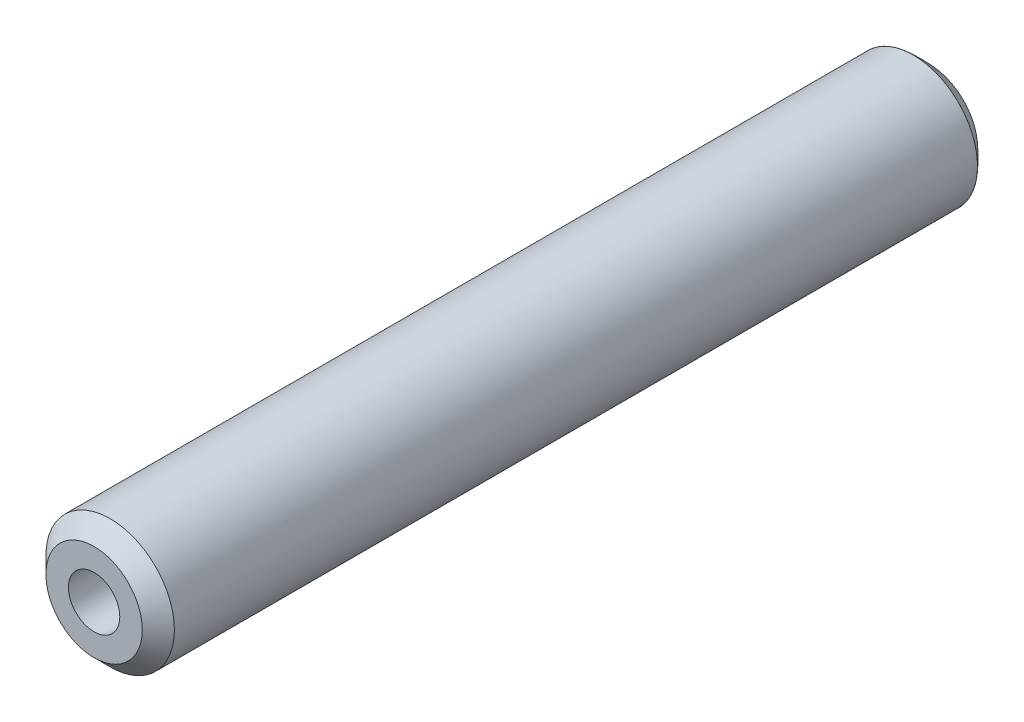
ISO-10303-21;
HEADER;
FILE_DESCRIPTION(('STEP AP214'),'2;1');
FILE_NAME('part.step','',(''),(''),'','','');
FILE_SCHEMA(('AUTOMOTIVE_DESIGN { 1 0 10303 214 1 1 1 1 }'));
ENDSEC;
DATA;
#1=APPLICATION_CONTEXT('core data for automotive mechanical design processes');
#2=APPLICATION_PROTOCOL_DEFINITION('international standard','automotive_design',2000,#1);
#3=PRODUCT_CONTEXT('',#1,'mechanical');
#4=PRODUCT('Part','Part','',(#3));
#5=PRODUCT_RELATED_PRODUCT_CATEGORY('part','',(#4));
#6=PRODUCT_DEFINITION_FORMATION('','',#4);
#7=PRODUCT_DEFINITION_CONTEXT('part definition',#1,'design');
#8=PRODUCT_DEFINITION('design','',#6,#7);
#9=PRODUCT_DEFINITION_SHAPE('','',#8);
#10=(LENGTH_UNIT() NAMED_UNIT(*) SI_UNIT(.MILLI.,.METRE.));
#11=(NAMED_UNIT(*) PLANE_ANGLE_UNIT() SI_UNIT($,.RADIAN.));
#12=(NAMED_UNIT(*) SI_UNIT($,.STERADIAN.) SOLID_ANGLE_UNIT());
#13=UNCERTAINTY_MEASURE_WITH_UNIT(LENGTH_MEASURE(1.E-05),#10,'distance_accuracy_value','');
#14=(GEOMETRIC_REPRESENTATION_CONTEXT(3) GLOBAL_UNCERTAINTY_ASSIGNED_CONTEXT((#13)) GLOBAL_UNIT_ASSIGNED_CONTEXT((#10,
#11,#12)) REPRESENTATION_CONTEXT('',''));
#15=CARTESIAN_POINT('',(0.,0.,0.));
#16=DIRECTION('',(0.,0.,1.));
#17=DIRECTION('',(1.,0.,0.));
#18=AXIS2_PLACEMENT_3D('',#15,#16,#17);
#19=CARTESIAN_POINT('',(-15.,-17.5,-8.));
#20=DIRECTION('',(0.,0.,1.));
#21=DIRECTION('',(1.,0.,0.));
#22=AXIS2_PLACEMENT_3D('',#19,#20,#21);
#23=CYLINDRICAL_SURFACE('',#22,2.);
#24=CARTESIAN_POINT('',(-13.,-17.5,2.5));
#25=CARTESIAN_POINT('',(-12.9999999470683,-17.5327241974965,2.5));
#26=CARTESIAN_POINT('',(-13.0008133145145,-17.5654477404733,2.5));
#27=CARTESIAN_POINT('',(-13.0040514588773,-17.6308145667304,2.5));
#28=CARTESIAN_POINT('',(-13.0064762098141,-17.6634578512962,2.5));
#29=CARTESIAN_POINT('',(-13.0129217490919,-17.728586858663,2.5));
#30=CARTESIAN_POINT('',(-13.0169425662685,-17.7610725786067,2.5));
#31=CARTESIAN_POINT('',(-13.0265648763823,-17.8258096124799,2.5));
#32=CARTESIAN_POINT('',(-13.0321663972611,-17.8580609222555,2.5));
#33=CARTESIAN_POINT('',(-13.0449348270466,-17.9222521602081,2.5));
#34=CARTESIAN_POINT('',(-13.0521017359533,-17.9541920883852,2.5));
#35=CARTESIAN_POINT('',(-13.0679856784994,-18.0176836192475,2.5));
#36=CARTESIAN_POINT('',(-13.0767026847343,-18.0492352287873,2.5));
#37=CARTESIAN_POINT('',(-13.0956715471788,-18.1118731398176,2.5));
#38=CARTESIAN_POINT('',(-13.1059233756553,-18.1429594497045,2.5));
#39=CARTESIAN_POINT('',(-13.1279466255026,-18.204589882949,2.5));
#40=CARTESIAN_POINT('',(-13.1397180713705,-18.2351339975571,2.5));
#41=CARTESIAN_POINT('',(-13.1647637985844,-18.2955997319033,2.5));
#42=CARTESIAN_POINT('',(-13.1780380799305,-18.3255213516415,2.5));
#43=CARTESIAN_POINT('',(-13.2060445879555,-18.3846734382671,2.5));
#44=CARTESIAN_POINT('',(-13.2207767911255,-18.4139039162898,2.5));
#45=CARTESIAN_POINT('',(-13.2516554712828,-18.4716086190359,2.5));
#46=CARTESIAN_POINT('',(-13.2678019738175,-18.5000828300863,2.5));
#47=CARTESIAN_POINT('',(-13.3014656231934,-18.5562097662276,2.5));
#48=CARTESIAN_POINT('',(-13.3189827942595,-18.5838624767875,2.5));
#49=CARTESIAN_POINT('',(-13.3553442074814,-18.6382811773542,2.5));
#50=CARTESIAN_POINT('',(-13.3741884496371,-18.6650471673609,2.5));
#51=CARTESIAN_POINT('',(-13.413160456272,-18.7176271725797,2.5));
#52=CARTESIAN_POINT('',(-13.4332881980557,-18.7434412046119,2.5));
#53=CARTESIAN_POINT('',(-13.4747836325416,-18.7940520189103,2.5));
#54=CARTESIAN_POINT('',(-13.4961513028349,-18.8188488195468,2.5));
#55=CARTESIAN_POINT('',(-13.5400830783593,-18.867359982631,2.5));
#56=CARTESIAN_POINT('',(-13.5626472028745,-18.8910743276207,2.5));
#57=CARTESIAN_POINT('',(-13.6089256723793,-18.9373527971255,2.5));
#58=CARTESIAN_POINT('',(-13.632640017369,-18.9599169216407,2.5));
#59=CARTESIAN_POINT('',(-13.6811511804532,-19.0038486971651,2.5));
#60=CARTESIAN_POINT('',(-13.7059479810897,-19.0252163674584,2.5));
#61=CARTESIAN_POINT('',(-13.7565587953881,-19.0667118019444,2.5));
#62=CARTESIAN_POINT('',(-13.7823728274204,-19.0868395437281,2.5));
#63=CARTESIAN_POINT('',(-13.8349528326392,-19.1258115503629,2.5));
#64=CARTESIAN_POINT('',(-13.8617188226459,-19.1446557925186,2.5));
#65=CARTESIAN_POINT('',(-13.9161375232125,-19.1810172057405,2.5));
#66=CARTESIAN_POINT('',(-13.9437902337723,-19.1985343768067,2.5));
#67=CARTESIAN_POINT('',(-13.999917169914,-19.2321980261825,2.5));
#68=CARTESIAN_POINT('',(-14.0283913809649,-19.2483445287172,2.5));
#69=CARTESIAN_POINT('',(-14.0860960837096,-19.2792232088746,2.5));
#70=CARTESIAN_POINT('',(-14.1153265617303,-19.2939554120449,2.5));
#71=CARTESIAN_POINT('',(-14.1744786483612,-19.3219619200691,2.5));
#72=CARTESIAN_POINT('',(-14.2044002681068,-19.3352362014142,2.5));
#73=CARTESIAN_POINT('',(-14.2648660024329,-19.3602819286309,2.5));
#74=CARTESIAN_POINT('',(-14.2954101170135,-19.3720533745026,2.5));
#75=CARTESIAN_POINT('',(-14.3570405503329,-19.3940766243394,2.5));
#76=CARTESIAN_POINT('',(-14.3881268603222,-19.4043284528016,2.5));
#77=CARTESIAN_POINT('',(-14.4507647710728,-19.4232973152853,2.5));
#78=CARTESIAN_POINT('',(-14.4823163802305,-19.4320143215736,2.5));
#79=CARTESIAN_POINT('',(-14.5458079121367,-19.4478982639735,2.5));
#80=CARTESIAN_POINT('',(-14.5777478417398,-19.4550651726805,2.5));
#81=CARTESIAN_POINT('',(-14.6419390757965,-19.4678336030117,2.5));
#82=CARTESIAN_POINT('',(-14.6741903802501,-19.473435124636,2.5));
#83=CARTESIAN_POINT('',(-14.7389274286631,-19.4830574327131,2.5));
#84=CARTESIAN_POINT('',(-14.7714131684681,-19.4870782471077,2.5));
#85=CARTESIAN_POINT('',(-14.8365421215731,-19.4935237939862,2.5));
#86=CARTESIAN_POINT('',(-14.8691853320174,-19.4959485553054,2.5));
#87=CARTESIAN_POINT('',(-14.9345523607804,-19.4991866713026,2.5));
#88=CARTESIAN_POINT('',(-14.9672761803902,-19.5,2.5));
#89=CARTESIAN_POINT('',(-15.0327238196098,-19.5,2.5));
#90=CARTESIAN_POINT('',(-15.0654476392196,-19.4991866713026,2.5));
#91=CARTESIAN_POINT('',(-15.1308146679825,-19.4959485553054,2.5));
#92=CARTESIAN_POINT('',(-15.1634578784269,-19.4935237939862,2.5));
#93=CARTESIAN_POINT('',(-15.2285868315319,-19.4870782471077,2.5));
#94=CARTESIAN_POINT('',(-15.2610725713369,-19.4830574327131,2.5));
#95=CARTESIAN_POINT('',(-15.3258096197499,-19.473435124636,2.5));
#96=CARTESIAN_POINT('',(-15.3580609242035,-19.4678336030117,2.5));
#97=CARTESIAN_POINT('',(-15.4222521582602,-19.4550651726805,2.5));
#98=CARTESIAN_POINT('',(-15.4541920878634,-19.4478982639735,2.5));
#99=CARTESIAN_POINT('',(-15.5176836197695,-19.4320143215736,2.5));
#100=CARTESIAN_POINT('',(-15.5492352289273,-19.4232973152853,2.5));
#101=CARTESIAN_POINT('',(-15.6118731396778,-19.4043284528016,2.5));
#102=CARTESIAN_POINT('',(-15.6429594496671,-19.3940766243394,2.5));
#103=CARTESIAN_POINT('',(-15.7045898829865,-19.3720533745026,2.5));
#104=CARTESIAN_POINT('',(-15.7351339975671,-19.3602819286309,2.5));
#105=CARTESIAN_POINT('',(-15.7955997318932,-19.3352362014142,2.5));
#106=CARTESIAN_POINT('',(-15.8255213516387,-19.3219619200691,2.5));
#107=CARTESIAN_POINT('',(-15.8846734382697,-19.2939554120449,2.5));
#108=CARTESIAN_POINT('',(-15.9139039162904,-19.2792232088746,2.5));
#109=CARTESIAN_POINT('',(-15.9716086190351,-19.2483445287171,2.5));
#110=CARTESIAN_POINT('',(-16.0000828300861,-19.2321980261824,2.5));
#111=CARTESIAN_POINT('',(-16.0562097662278,-19.1985343768065,2.5));
#112=CARTESIAN_POINT('',(-16.0838624767876,-19.1810172057404,2.5));
#113=CARTESIAN_POINT('',(-16.1382811773542,-19.1446557925184,2.5));
#114=CARTESIAN_POINT('',(-16.165047167361,-19.1258115503627,2.5));
#115=CARTESIAN_POINT('',(-16.2176271725798,-19.0868395437278,2.5));
#116=CARTESIAN_POINT('',(-16.2434412046121,-19.0667118019442,2.5));
#117=CARTESIAN_POINT('',(-16.2940520189105,-19.0252163674582,2.5));
#118=CARTESIAN_POINT('',(-16.3188488195469,-19.003848697165,2.5));
#119=CARTESIAN_POINT('',(-16.3673599826311,-18.9599169216406,2.5));
#120=CARTESIAN_POINT('',(-16.3910743276207,-18.9373527971255,2.5));
#121=CARTESIAN_POINT('',(-16.4373527971255,-18.8910743276207,2.5));
#122=CARTESIAN_POINT('',(-16.4599169216406,-18.8673599826311,2.5));
#123=CARTESIAN_POINT('',(-16.5038486971649,-18.818848819547,2.5));
#124=CARTESIAN_POINT('',(-16.5252163674582,-18.7940520189105,2.5));
#125=CARTESIAN_POINT('',(-16.5667118019441,-18.7434412046122,2.5));
#126=CARTESIAN_POINT('',(-16.5868395437278,-18.7176271725799,2.5));
#127=CARTESIAN_POINT('',(-16.6258115503626,-18.6650471673611,2.5));
#128=CARTESIAN_POINT('',(-16.6446557925184,-18.6382811773543,2.5));
#129=CARTESIAN_POINT('',(-16.6810172057403,-18.5838624767878,2.5));
#130=CARTESIAN_POINT('',(-16.6985343768065,-18.5562097662279,2.5));
#131=CARTESIAN_POINT('',(-16.7321980261823,-18.5000828300862,2.5));
#132=CARTESIAN_POINT('',(-16.748344528717,-18.4716086190353,2.5));
#133=CARTESIAN_POINT('',(-16.7792232088745,-18.4139039162905,2.5));
#134=CARTESIAN_POINT('',(-16.7939554120448,-18.3846734382698,2.5));
#135=CARTESIAN_POINT('',(-16.8219619200691,-18.3255213516388,2.5));
#136=CARTESIAN_POINT('',(-16.8352362014142,-18.2955997318933,2.5));
#137=CARTESIAN_POINT('',(-16.8602819286309,-18.2351339975671,2.5));
#138=CARTESIAN_POINT('',(-16.8720533745026,-18.2045898829865,2.5));
#139=CARTESIAN_POINT('',(-16.8940766243394,-18.142959449667,2.5));
#140=CARTESIAN_POINT('',(-16.9043284528016,-18.1118731396777,2.5));
#141=CARTESIAN_POINT('',(-16.9232973152853,-18.0492352289272,2.5));
#142=CARTESIAN_POINT('',(-16.9320143215737,-18.0176836197694,2.5));
#143=CARTESIAN_POINT('',(-16.9478982639735,-17.9541920878632,2.5));
#144=CARTESIAN_POINT('',(-16.9550651726805,-17.9222521582601,2.5));
#145=CARTESIAN_POINT('',(-16.9678336030117,-17.8580609242034,2.5));
#146=CARTESIAN_POINT('',(-16.973435124636,-17.8258096197499,2.5));
#147=CARTESIAN_POINT('',(-16.9830574327131,-17.7610725713369,2.5));
#148=CARTESIAN_POINT('',(-16.9870782471077,-17.7285868315319,2.5));
#149=CARTESIAN_POINT('',(-16.9935237939862,-17.6634578784269,2.5));
#150=CARTESIAN_POINT('',(-16.9959485553054,-17.6308146679825,2.5));
#151=CARTESIAN_POINT('',(-16.9991866713026,-17.5654476392196,2.5));
#152=CARTESIAN_POINT('',(-17.,-17.5327238196098,2.5));
#153=CARTESIAN_POINT('',(-17.,-17.4672761803902,2.5));
#154=CARTESIAN_POINT('',(-16.9991866713026,-17.4345523607805,2.5));
#155=CARTESIAN_POINT('',(-16.9959485553054,-17.3691853320175,2.5));
#156=CARTESIAN_POINT('',(-16.9935237939862,-17.3365421215732,2.5));
#157=CARTESIAN_POINT('',(-16.9870782471077,-17.2714131684682,2.5));
#158=CARTESIAN_POINT('',(-16.9830574327132,-17.2389274286632,2.5));
#159=CARTESIAN_POINT('',(-16.973435124636,-17.1741903802502,2.5));
#160=CARTESIAN_POINT('',(-16.9678336030118,-17.1419390757966,2.5));
#161=CARTESIAN_POINT('',(-16.9550651726805,-17.0777478417399,2.5));
#162=CARTESIAN_POINT('',(-16.9478982639736,-17.0458079121368,2.5));
#163=CARTESIAN_POINT('',(-16.9320143215737,-16.9823163802306,2.5));
#164=CARTESIAN_POINT('',(-16.9232973152853,-16.9507647710729,2.5));
#165=CARTESIAN_POINT('',(-16.9043284528016,-16.8881268603223,2.5));
#166=CARTESIAN_POINT('',(-16.8940766243394,-16.857040550333,2.5));
#167=CARTESIAN_POINT('',(-16.8720533745026,-16.7954101170136,2.5));
#168=CARTESIAN_POINT('',(-16.8602819286309,-16.7648660024329,2.5));
#169=CARTESIAN_POINT('',(-16.8352362014142,-16.7044002681067,2.5));
#170=CARTESIAN_POINT('',(-16.8219619200691,-16.6744786483612,2.5));
#171=CARTESIAN_POINT('',(-16.7939554120448,-16.6153265617302,2.5));
#172=CARTESIAN_POINT('',(-16.7792232088745,-16.5860960837095,2.5));
#173=CARTESIAN_POINT('',(-16.7483445287171,-16.5283913809648,2.5));
#174=CARTESIAN_POINT('',(-16.7321980261824,-16.4999171699139,2.5));
#175=CARTESIAN_POINT('',(-16.6985343768066,-16.4437902337722,2.5));
#176=CARTESIAN_POINT('',(-16.6810172057405,-16.4161375232124,2.5));
#177=CARTESIAN_POINT('',(-16.6446557925186,-16.3617188226458,2.5));
#178=CARTESIAN_POINT('',(-16.6258115503628,-16.3349528326391,2.5));
#179=CARTESIAN_POINT('',(-16.586839543728,-16.2823728274203,2.5));
#180=CARTESIAN_POINT('',(-16.5667118019443,-16.256558795388,2.5));
#181=CARTESIAN_POINT('',(-16.5252163674584,-16.2059479810897,2.5));
#182=CARTESIAN_POINT('',(-16.5038486971651,-16.1811511804532,2.5));
#183=CARTESIAN_POINT('',(-16.4599169216407,-16.132640017369,2.5));
#184=CARTESIAN_POINT('',(-16.4373527971255,-16.1089256723793,2.5));
#185=CARTESIAN_POINT('',(-16.3910743276207,-16.0626472028745,2.5));
#186=CARTESIAN_POINT('',(-16.367359982631,-16.0400830783593,2.5));
#187=CARTESIAN_POINT('',(-16.3188488195468,-15.9961513028349,2.5));
#188=CARTESIAN_POINT('',(-16.2940520189103,-15.9747836325416,2.5));
#189=CARTESIAN_POINT('',(-16.2434412046119,-15.9332881980557,2.5));
#190=CARTESIAN_POINT('',(-16.2176271725797,-15.913160456272,2.5));
#191=CARTESIAN_POINT('',(-16.1650471673609,-15.8741884496372,2.5));
#192=CARTESIAN_POINT('',(-16.1382811773541,-15.8553442074814,2.5));
#193=CARTESIAN_POINT('',(-16.0838624767876,-15.8189827942595,2.5));
#194=CARTESIAN_POINT('',(-16.0562097662278,-15.8014656231934,2.5));
#195=CARTESIAN_POINT('',(-16.0000828300861,-15.7678019738176,2.5));
#196=CARTESIAN_POINT('',(-15.9716086190352,-15.7516554712829,2.5));
#197=CARTESIAN_POINT('',(-15.9139039162905,-15.7207767911254,2.5));
#198=CARTESIAN_POINT('',(-15.8846734382698,-15.7060445879551,2.5));
#199=CARTESIAN_POINT('',(-15.8255213516388,-15.6780380799309,2.5));
#200=CARTESIAN_POINT('',(-15.7955997318933,-15.6647637985858,2.5));
#201=CARTESIAN_POINT('',(-15.7351339975671,-15.6397180713691,2.5));
#202=CARTESIAN_POINT('',(-15.7045898829865,-15.6279466254974,2.5));
#203=CARTESIAN_POINT('',(-15.642959449667,-15.6059233756606,2.5));
#204=CARTESIAN_POINT('',(-15.6118731396778,-15.5956715471984,2.5));
#205=CARTESIAN_POINT('',(-15.5492352289272,-15.5767026847147,2.5));
#206=CARTESIAN_POINT('',(-15.5176836197695,-15.5679856784263,2.5));
#207=CARTESIAN_POINT('',(-15.4541920878633,-15.5521017360264,2.5));
#208=CARTESIAN_POINT('',(-15.4222521582602,-15.5449348273195,2.5));
#209=CARTESIAN_POINT('',(-15.3580609242036,-15.5321663969883,2.5));
#210=CARTESIAN_POINT('',(-15.32580961975,-15.526564875364,2.5));
#211=CARTESIAN_POINT('',(-15.261072571337,-15.5169425672869,2.5));
#212=CARTESIAN_POINT('',(-15.228586831532,-15.5129217528923,2.5));
#213=CARTESIAN_POINT('',(-15.163457878427,-15.5064762060138,2.5));
#214=CARTESIAN_POINT('',(-15.1308146679826,-15.5040514446946,2.5));
#215=CARTESIAN_POINT('',(-15.0654476392196,-15.5008133286974,2.5));
#216=CARTESIAN_POINT('',(-15.0327238196098,-15.5,2.5));
#217=CARTESIAN_POINT('',(-14.9672761803902,-15.5,2.5));
#218=CARTESIAN_POINT('',(-14.9345523607804,-15.5008133286974,2.5));
#219=CARTESIAN_POINT('',(-14.8691853320173,-15.5040514446946,2.5));
#220=CARTESIAN_POINT('',(-14.836542121573,-15.5064762060138,2.5));
#221=CARTESIAN_POINT('',(-14.771413168468,-15.5129217528923,2.5));
#222=CARTESIAN_POINT('',(-14.738927428663,-15.5169425672869,2.5));
#223=CARTESIAN_POINT('',(-14.67419038025,-15.526564875364,2.5));
#224=CARTESIAN_POINT('',(-14.6419390757964,-15.5321663969883,2.5));
#225=CARTESIAN_POINT('',(-14.5777478417397,-15.5449348273195,2.5));
#226=CARTESIAN_POINT('',(-14.5458079121366,-15.5521017360265,2.5));
#227=CARTESIAN_POINT('',(-14.4823163802305,-15.5679856784264,2.5));
#228=CARTESIAN_POINT('',(-14.4507647710728,-15.5767026847147,2.5));
#229=CARTESIAN_POINT('',(-14.3881268603222,-15.5956715471984,2.5));
#230=CARTESIAN_POINT('',(-14.3570405503329,-15.6059233756606,2.5));
#231=CARTESIAN_POINT('',(-14.2954101170135,-15.6279466254974,2.5));
#232=CARTESIAN_POINT('',(-14.2648660024329,-15.6397180713691,2.5));
#233=CARTESIAN_POINT('',(-14.2044002681067,-15.6647637985858,2.5));
#234=CARTESIAN_POINT('',(-14.1744786483612,-15.6780380799309,2.5));
#235=CARTESIAN_POINT('',(-14.1153265617302,-15.7060445879552,2.5));
#236=CARTESIAN_POINT('',(-14.0860960837095,-15.7207767911255,2.5));
#237=CARTESIAN_POINT('',(-14.0283913809648,-15.7516554712829,2.5));
#238=CARTESIAN_POINT('',(-13.9999171699139,-15.7678019738176,2.5));
#239=CARTESIAN_POINT('',(-13.9437902337721,-15.8014656231935,2.5));
#240=CARTESIAN_POINT('',(-13.9161375232123,-15.8189827942596,2.5));
#241=CARTESIAN_POINT('',(-13.8617188226458,-15.8553442074815,2.5));
#242=CARTESIAN_POINT('',(-13.834952832639,-15.8741884496373,2.5));
#243=CARTESIAN_POINT('',(-13.7823728274202,-15.9131604562721,2.5));
#244=CARTESIAN_POINT('',(-13.7565587953879,-15.9332881980558,2.5));
#245=CARTESIAN_POINT('',(-13.7059479810896,-15.9747836325417,2.5));
#246=CARTESIAN_POINT('',(-13.6811511804531,-15.996151302835,2.5));
#247=CARTESIAN_POINT('',(-13.6326400173689,-16.0400830783594,2.5));
#248=CARTESIAN_POINT('',(-13.6089256723793,-16.0626472028745,2.5));
#249=CARTESIAN_POINT('',(-13.5626472028745,-16.1089256723793,2.5));
#250=CARTESIAN_POINT('',(-13.5400830783594,-16.1326400173689,2.5));
#251=CARTESIAN_POINT('',(-13.496151302835,-16.1811511804531,2.5));
#252=CARTESIAN_POINT('',(-13.4747836325417,-16.2059479810896,2.5));
#253=CARTESIAN_POINT('',(-13.4332881980558,-16.2565587953879,2.5));
#254=CARTESIAN_POINT('',(-13.4131604562721,-16.2823728274202,2.5));
#255=CARTESIAN_POINT('',(-13.3741884496373,-16.334952832639,2.5));
#256=CARTESIAN_POINT('',(-13.3553442074815,-16.3617188226457,2.5));
#257=CARTESIAN_POINT('',(-13.3189827942596,-16.4161375232124,2.5));
#258=CARTESIAN_POINT('',(-13.3014656231935,-16.4437902337723,2.5));
#259=CARTESIAN_POINT('',(-13.2678019738176,-16.4999171699137,2.5));
#260=CARTESIAN_POINT('',(-13.2516554712828,-16.5283913809641,2.5));
#261=CARTESIAN_POINT('',(-13.2207767911256,-16.5860960837102,2.5));
#262=CARTESIAN_POINT('',(-13.2060445879555,-16.6153265617329,2.5));
#263=CARTESIAN_POINT('',(-13.1780380799305,-16.6744786483585,2.5));
#264=CARTESIAN_POINT('',(-13.1647637985844,-16.7044002680967,2.5));
#265=CARTESIAN_POINT('',(-13.1397180713705,-16.764866002443,2.5));
#266=CARTESIAN_POINT('',(-13.1279466255026,-16.795410117051,2.5));
#267=CARTESIAN_POINT('',(-13.1059233756553,-16.8570405502955,2.5));
#268=CARTESIAN_POINT('',(-13.0956715471788,-16.8881268601824,2.5));
#269=CARTESIAN_POINT('',(-13.0767026847342,-16.9507647712127,2.5));
#270=CARTESIAN_POINT('',(-13.0679856784994,-16.9823163807526,2.5));
#271=CARTESIAN_POINT('',(-13.0521017359533,-17.0458079116148,2.5));
#272=CARTESIAN_POINT('',(-13.0449348270466,-17.0777478397919,2.5));
#273=CARTESIAN_POINT('',(-13.0321663972611,-17.1419390777446,2.5));
#274=CARTESIAN_POINT('',(-13.0265648763823,-17.1741903875201,2.5));
#275=CARTESIAN_POINT('',(-13.0169425662685,-17.2389274213933,2.5));
#276=CARTESIAN_POINT('',(-13.0129217490919,-17.271413141337,2.5));
#277=CARTESIAN_POINT('',(-13.0064762098141,-17.3365421487038,2.5));
#278=CARTESIAN_POINT('',(-13.0040514588773,-17.3691854332696,2.5));
#279=CARTESIAN_POINT('',(-13.0008133145145,-17.4345522595267,2.5));
#280=CARTESIAN_POINT('',(-12.9999999470683,-17.4672758025035,2.5));
#281=CARTESIAN_POINT('',(-13.,-17.5,2.5));
#282=B_SPLINE_CURVE_WITH_KNOTS('',3,(#24,#25,#26,#27,#28,#29,#30,#31,#32,#33,#34,#35,#36,#37,
#38,#39,#40,#41,#42,#43,#44,#45,#46,#47,#48,#49,#50,#51,#52,#53,#54,#55,#56,#57,#58,#59,#60,#61,
#62,#63,#64,#65,#66,#67,#68,#69,#70,#71,#72,#73,#74,#75,#76,#77,#78,#79,#80,#81,#82,#83,#84,#85,
#86,#87,#88,#89,#90,#91,#92,#93,#94,#95,#96,#97,#98,#99,#100,#101,#102,#103,#104,#105,#106,#107,
#108,#109,#110,#111,#112,#113,#114,#115,#116,#117,#118,#119,#120,#121,#122,#123,#124,#125,#126,
#127,#128,#129,#130,#131,#132,#133,#134,#135,#136,#137,#138,#139,#140,#141,#142,#143,#144,#145,
#146,#147,#148,#149,#150,#151,#152,#153,#154,#155,#156,#157,#158,#159,#160,#161,#162,#163,#164,
#165,#166,#167,#168,#169,#170,#171,#172,#173,#174,#175,#176,#177,#178,#179,#180,#181,#182,#183,
#184,#185,#186,#187,#188,#189,#190,#191,#192,#193,#194,#195,#196,#197,#198,#199,#200,#201,#202,
#203,#204,#205,#206,#207,#208,#209,#210,#211,#212,#213,#214,#215,#216,#217,#218,#219,#220,#221,
#222,#223,#224,#225,#226,#227,#228,#229,#230,#231,#232,#233,#234,#235,#236,#237,#238,#239,#240,
#241,#242,#243,#244,#245,#246,#247,#248,#249,#250,#251,#252,#253,#254,#255,#256,#257,#258,#259,
#260,#261,#262,#263,#264,#265,#266,#267,#268,#269,#270,#271,#272,#273,#274,#275,#276,#277,#278,
#279,#280,#281),.UNSPECIFIED.,.F.,.F.,(4,2,2,2,2,2,2,2,2,2,2,2,2,2,2,2,2,2,2,2,2,2,2,2,2,2,2,2,
2,2,2,2,2,2,2,2,2,2,2,2,2,2,2,2,2,2,2,2,2,2,2,2,2,2,2,2,2,2,2,2,2,2,2,2,2,2,2,2,2,2,2,2,2,2,2,2,
2,2,2,2,2,2,2,2,2,2,2,2,2,2,2,2,2,2,2,2,2,2,2,2,2,2,2,2,2,2,2,2,2,2,2,2,2,2,2,2,2,2,2,2,2,2,2,2,
2,2,2,2,4),(0.,0.0981615585893566,0.196321534588035,0.294483284087453,0.392646768874277,
0.490810253661114,0.588972003160559,0.68713197915929,0.785293537748715,0.883455096338132,
0.981615072336836,1.07977682183625,1.17794030662306,1.27610379140988,1.3742655409093,
1.472425516908,1.57058707549743,1.66874863408687,1.76690861008559,1.86507035958504,
1.96323384437187,2.06139732915869,2.1595590786581,2.25771905465677,2.35588061324614,
2.45404217183551,2.55220214783421,2.65036389733365,2.74852738212049,2.84669086690734,
2.94485261640678,3.04301259240547,3.14117415099485,3.23933570958422,3.33749568558293,
3.43565743508239,3.53382091986925,3.63198440465611,3.73014615415554,3.82830613015422,
3.92646768874356,4.02462924733292,4.12278922333164,4.22095097283114,4.31911445761804,
4.41727794240493,4.51543969190438,4.61359966790302,4.71176122649225,4.80992278508147,
4.90808276108008,5.00624451057949,5.10440799536635,5.20257148015324,5.30073322965274,
5.39889320565152,5.49705476424096,5.59521632283039,5.69337629882911,5.79153804832855,
5.88970153311538,5.9878650179022,6.08602676740162,6.1841867434003,6.28234830198967,
6.38050986057903,6.47866983657769,6.57683158607709,6.67499507086391,6.77315855565073,
6.87132030515018,6.96948028114892,7.06764183973838,7.16580339832784,7.26396337432656,
7.36212512382598,7.46028860861278,7.55845209339957,7.65661384289898,7.75477381889767,
7.8529353774871,7.95109693607652,8.04925691207524,8.14741866157465,8.24558214636147,
8.34374563114827,8.44190738064769,8.5400673566464,8.63822891523581,8.73639047382523,
8.83455044982392,8.93271219932332,9.03087568411011,9.12903916889692,9.22720091839634,
9.32536089439506,9.42352245298453,9.52168401157399,9.61984398757272,9.71800573707215,
9.81616922185895,9.91433270664575,10.0124944561452,10.1106544321438,10.2088159907332,
10.3069775493227,10.4051375253214,10.5032992748209,10.6014627596077,10.6996262443946,
10.797787993894,10.8959479698926,10.994109528482,11.0922710870713,11.1904310630699,
11.2885928125693,11.3867562973562,11.484919782143,11.5830815316425,11.6812415076412,
11.7794030662307,11.8775646248201,11.9757246008188,12.0738863503183,12.1720498351051,
12.2702133198919,12.3683750693913,12.46653504539,12.5646966039794),.UNSPECIFIED.);
#283=CARTESIAN_POINT('',(-13.,-17.5,2.5));
#284=VERTEX_POINT('',#283);
#285=EDGE_CURVE('E60',#284,#284,#282,.F.);
#286=ORIENTED_EDGE('',*,*,#285,.T.);
#287=EDGE_LOOP('',(#286));
#288=FACE_BOUND('',#287,.T.);
#289=CARTESIAN_POINT('',(-15.,-17.5,27.5));
#290=DIRECTION('',(0.,0.,1.));
#291=DIRECTION('',(1.,0.,0.));
#292=AXIS2_PLACEMENT_3D('',#289,#290,#291);
#293=CIRCLE('',#292,2.);
#294=CARTESIAN_POINT('',(-13.,-17.5,27.5));
#295=VERTEX_POINT('',#294);
#296=EDGE_CURVE('E76',#295,#295,#293,.F.);
#297=ORIENTED_EDGE('',*,*,#296,.T.);
#298=EDGE_LOOP('',(#297));
#299=FACE_BOUND('',#298,.T.);
#300=ADVANCED_FACE('F47',(#288,#299),#23,.T.);
#301=CARTESIAN_POINT('',(-15.,-17.5,28.));
#302=DIRECTION('',(0.,0.,1.));
#303=DIRECTION('',(1.,0.,0.));
#304=AXIS2_PLACEMENT_3D('',#301,#302,#303);
#305=PLANE('',#304);
#306=CARTESIAN_POINT('',(-15.,-17.5,28.));
#307=DIRECTION('',(0.,0.,1.));
#308=DIRECTION('',(1.,0.,0.));
#309=AXIS2_PLACEMENT_3D('',#306,#307,#308);
#310=CIRCLE('',#309,0.79999999999999);
#311=CARTESIAN_POINT('',(-14.2,-17.5,28.));
#312=VERTEX_POINT('',#311);
#313=EDGE_CURVE('E90',#312,#312,#310,.T.);
#314=ORIENTED_EDGE('',*,*,#313,.F.);
#315=EDGE_LOOP('',(#314));
#316=FACE_BOUND('',#315,.T.);
#317=CARTESIAN_POINT('',(-15.,-17.5,28.));
#318=DIRECTION('',(0.,0.,1.));
#319=DIRECTION('',(1.,0.,0.));
#320=AXIS2_PLACEMENT_3D('',#317,#318,#319);
#321=CIRCLE('',#320,1.5);
#322=CARTESIAN_POINT('',(-13.5,-17.5,28.));
#323=VERTEX_POINT('',#322);
#324=EDGE_CURVE('E80',#323,#323,#321,.T.);
#325=ORIENTED_EDGE('',*,*,#324,.T.);
#326=EDGE_LOOP('',(#325));
#327=FACE_BOUND('',#326,.T.);
#328=ADVANCED_FACE('F111',(#316,#327),#305,.T.);
#329=CARTESIAN_POINT('',(-15.,-17.5,28.));
#330=DIRECTION('',(0.,0.,-1.));
#331=DIRECTION('',(-1.,0.,0.));
#332=AXIS2_PLACEMENT_3D('',#329,#330,#331);
#333=CONICAL_SURFACE('',#332,1.5,0.785398163397441);
#334=ORIENTED_EDGE('',*,*,#296,.F.);
#335=EDGE_LOOP('',(#334));
#336=FACE_BOUND('',#335,.T.);
#337=ORIENTED_EDGE('',*,*,#324,.F.);
#338=EDGE_LOOP('',(#337));
#339=FACE_BOUND('',#338,.T.);
#340=ADVANCED_FACE('F112',(#336,#339),#333,.T.);
#341=CARTESIAN_POINT('',(-15.,-17.5,21.));
#342=DIRECTION('',(0.,0.,1.));
#343=DIRECTION('',(1.,0.,0.));
#344=AXIS2_PLACEMENT_3D('',#341,#342,#343);
#345=CONICAL_SURFACE('',#344,0.799999999999988,1.02974425867665);
#346=CARTESIAN_POINT('',(-15.,-17.5,20.5193115047779));
#347=VERTEX_POINT('',#346);
#348=VERTEX_LOOP('',#347);
#349=FACE_BOUND('',#348,.T.);
#350=CARTESIAN_POINT('',(-15.,-17.5,21.));
#351=DIRECTION('',(0.,0.,1.));
#352=DIRECTION('',(1.,0.,0.));
#353=AXIS2_PLACEMENT_3D('',#350,#351,#352);
#354=CIRCLE('',#353,0.799999999999988);
#355=CARTESIAN_POINT('',(-14.2,-17.5,21.));
#356=VERTEX_POINT('',#355);
#357=EDGE_CURVE('E86',#356,#356,#354,.T.);
#358=ORIENTED_EDGE('',*,*,#357,.T.);
#359=EDGE_LOOP('',(#358));
#360=FACE_BOUND('',#359,.T.);
#361=ADVANCED_FACE('F116',(#349,#360),#345,.F.);
#362=CARTESIAN_POINT('',(-15.,-17.5,28.));
#363=DIRECTION('',(0.,0.,1.));
#364=DIRECTION('',(1.,0.,0.));
#365=AXIS2_PLACEMENT_3D('',#362,#363,#364);
#366=CYLINDRICAL_SURFACE('',#365,0.799999999999989);
#367=ORIENTED_EDGE('',*,*,#357,.F.);
#368=EDGE_LOOP('',(#367));
#369=FACE_BOUND('',#368,.T.);
#370=ORIENTED_EDGE('',*,*,#313,.T.);
#371=EDGE_LOOP('',(#370));
#372=FACE_BOUND('',#371,.T.);
#373=ADVANCED_FACE('F119',(#369,#372),#366,.F.);
#374=CARTESIAN_POINT('',(0.,0.,2.));
#375=DIRECTION('',(0.,0.,1.));
#376=DIRECTION('',(1.,0.,0.));
#377=AXIS2_PLACEMENT_3D('',#374,#375,#376);
#378=PLANE('',#377);
#379=CARTESIAN_POINT('',(-13.5,-17.5,2.));
#380=CARTESIAN_POINT('',(-13.5,-17.3036504736953,2.));
#381=CARTESIAN_POINT('',(-13.5390409905634,-17.1073781600239,2.));
#382=CARTESIAN_POINT('',(-13.6893204119028,-16.7445715428809,2.));
#383=CARTESIAN_POINT('',(-13.8004997466871,-16.578179909753,2.));
#384=CARTESIAN_POINT('',(-14.0781799097533,-16.3004997466874,2.));
#385=CARTESIAN_POINT('',(-14.2445715428808,-16.1893204119029,2.));
#386=CARTESIAN_POINT('',(-14.6073781600239,-16.0390409905632,2.));
#387=CARTESIAN_POINT('',(-14.8036504736949,-16.,2.));
#388=CARTESIAN_POINT('',(-15.1963495263051,-16.,2.));
#389=CARTESIAN_POINT('',(-15.3926218399761,-16.0390409905635,2.));
#390=CARTESIAN_POINT('',(-15.7554284571192,-16.1893204119026,2.));
#391=CARTESIAN_POINT('',(-15.9218200902467,-16.300499746687,2.));
#392=CARTESIAN_POINT('',(-16.199500253313,-16.5781799097533,2.));
#393=CARTESIAN_POINT('',(-16.3106795880971,-16.7445715428808,2.));
#394=CARTESIAN_POINT('',(-16.4609590094368,-17.1073781600239,2.));
#395=CARTESIAN_POINT('',(-16.5,-17.3036504736952,2.));
#396=CARTESIAN_POINT('',(-16.5,-17.6963495263048,2.));
#397=CARTESIAN_POINT('',(-16.4609590094365,-17.8926218399761,2.));
#398=CARTESIAN_POINT('',(-16.3106795880974,-18.2554284571192,2.));
#399=CARTESIAN_POINT('',(-16.1995002533126,-18.421820090247,2.));
#400=CARTESIAN_POINT('',(-15.921820090247,-18.6995002533126,2.));
#401=CARTESIAN_POINT('',(-15.755428457119,-18.8106795880974,2.));
#402=CARTESIAN_POINT('',(-15.3926218399763,-18.9609590094365,2.));
#403=CARTESIAN_POINT('',(-15.1963495263049,-19.,2.));
#404=CARTESIAN_POINT('',(-14.8036504736951,-19.,2.));
#405=CARTESIAN_POINT('',(-14.6073781600237,-18.9609590094368,2.));
#406=CARTESIAN_POINT('',(-14.244571542881,-18.8106795880971,2.));
#407=CARTESIAN_POINT('',(-14.0781799097531,-18.699500253313,2.));
#408=CARTESIAN_POINT('',(-13.8004997466872,-18.4218200902467,2.));
#409=CARTESIAN_POINT('',(-13.6893204119026,-18.2554284571192,2.));
#410=CARTESIAN_POINT('',(-13.5390409905635,-17.8926218399761,2.));
#411=CARTESIAN_POINT('',(-13.5,-17.6963495263047,2.));
#412=CARTESIAN_POINT('',(-13.5,-17.5,2.));
#413=(BOUNDED_CURVE() B_SPLINE_CURVE(3,(#379,#380,#381,#382,#383,#384,#385,#386,#387,#388,#389,
#390,#391,#392,#393,#394,#395,#396,#397,#398,#399,#400,#401,#402,#403,#404,#405,#406,#407,#408,
#409,#410,#411,#412),.UNSPECIFIED.,.T.,.F.) B_SPLINE_CURVE_WITH_KNOTS((4,2,2,2,2,2,2,2,2,2,2,2,
2,2,2,2,4),(0.,0.392699081698724,0.785398163397448,1.17809724509617,1.5707963267949,
1.96349540849362,2.35619449019234,2.74889357189107,3.14159265358979,3.53429173528852,
3.92699081698724,4.31968989868597,4.71238898038469,5.10508806208341,5.49778714378214,
5.89048622548086,6.28318530717959),
.UNSPECIFIED.) CURVE() GEOMETRIC_REPRESENTATION_ITEM() RATIONAL_B_SPLINE_CURVE((0.999999999999786,
0.999999999999786,0.999999999999786,0.999999999999786,0.999999999999786,0.999999999999786,
0.999999999999786,0.999999999999786,0.999999999999786,0.999999999999786,0.999999999999786,
0.999999999999786,0.999999999999786,0.999999999999786,0.999999999999786,0.999999999999786,
0.999999999999786,0.999999999999786,0.999999999999786,0.999999999999786,0.999999999999786,
0.999999999999786,0.999999999999786,0.999999999999786,0.999999999999786,0.999999999999786,
0.999999999999786,0.999999999999786,0.999999999999786,0.999999999999786,0.999999999999786,
0.999999999999786,0.999999999999786,0.999999999999786)) REPRESENTATION_ITEM(''));
#414=CARTESIAN_POINT('',(-13.5,-17.5,2.));
#415=VERTEX_POINT('',#414);
#416=EDGE_CURVE('E13',#415,#415,#413,.F.);
#417=ORIENTED_EDGE('',*,*,#416,.T.);
#418=EDGE_LOOP('',(#417));
#419=FACE_BOUND('',#418,.T.);
#420=CARTESIAN_POINT('',(-15.,-17.5,2.));
#421=DIRECTION('',(0.,0.,-1.));
#422=DIRECTION('',(-1.,0.,0.));
#423=AXIS2_PLACEMENT_3D('',#420,#421,#422);
#424=CIRCLE('',#423,0.79999999999999);
#425=CARTESIAN_POINT('',(-15.8,-17.5,2.));
#426=VERTEX_POINT('',#425);
#427=EDGE_CURVE('E77',#426,#426,#424,.T.);
#428=ORIENTED_EDGE('',*,*,#427,.F.);
#429=EDGE_LOOP('',(#428));
#430=FACE_BOUND('',#429,.T.);
#431=ADVANCED_FACE('F70',(#419,#430),#378,.F.);
#432=CARTESIAN_POINT('',(-15.,-17.5,8.99999999999999));
#433=DIRECTION('',(0.,0.,-1.));
#434=DIRECTION('',(-1.,0.,0.));
#435=AXIS2_PLACEMENT_3D('',#432,#433,#434);
#436=CONICAL_SURFACE('',#435,0.799999999999988,1.02974425867664);
#437=CARTESIAN_POINT('',(-15.,-17.5,9.48068849522205));
#438=VERTEX_POINT('',#437);
#439=VERTEX_LOOP('',#438);
#440=FACE_BOUND('',#439,.T.);
#441=CARTESIAN_POINT('',(-15.,-17.5,8.99999999999999));
#442=DIRECTION('',(0.,0.,-1.));
#443=DIRECTION('',(-1.,0.,0.));
#444=AXIS2_PLACEMENT_3D('',#441,#442,#443);
#445=CIRCLE('',#444,0.799999999999988);
#446=CARTESIAN_POINT('',(-15.8,-17.5,8.99999999999999));
#447=VERTEX_POINT('',#446);
#448=EDGE_CURVE('E74',#447,#447,#445,.T.);
#449=ORIENTED_EDGE('',*,*,#448,.T.);
#450=EDGE_LOOP('',(#449));
#451=FACE_BOUND('',#450,.T.);
#452=ADVANCED_FACE('F66',(#440,#451),#436,.F.);
#453=CARTESIAN_POINT('',(-15.,-17.5,2.));
#454=DIRECTION('',(0.,0.,-1.));
#455=DIRECTION('',(-1.,0.,0.));
#456=AXIS2_PLACEMENT_3D('',#453,#454,#455);
#457=CYLINDRICAL_SURFACE('',#456,0.799999999999989);
#458=ORIENTED_EDGE('',*,*,#448,.F.);
#459=EDGE_LOOP('',(#458));
#460=FACE_BOUND('',#459,.T.);
#461=ORIENTED_EDGE('',*,*,#427,.T.);
#462=EDGE_LOOP('',(#461));
#463=FACE_BOUND('',#462,.T.);
#464=ADVANCED_FACE('F69',(#460,#463),#457,.F.);
#465=CARTESIAN_POINT('',(-13.,-17.5,2.5));
#466=CARTESIAN_POINT('',(-13.,-17.2382006315935,2.5));
#467=CARTESIAN_POINT('',(-13.0520546540845,-16.9765042133653,2.5));
#468=CARTESIAN_POINT('',(-13.2524272158703,-16.4927620571744,2.5));
#469=CARTESIAN_POINT('',(-13.4006663289164,-16.2709065463374,2.5));
#470=CARTESIAN_POINT('',(-13.7709065463374,-15.9006663289164,2.5));
#471=CARTESIAN_POINT('',(-13.9927620571745,-15.7524272158703,2.5));
#472=CARTESIAN_POINT('',(-14.4765042133652,-15.5520546540845,2.5));
#473=CARTESIAN_POINT('',(-14.7382006315931,-15.5,2.5));
#474=CARTESIAN_POINT('',(-15.2617993684069,-15.5,2.5));
#475=CARTESIAN_POINT('',(-15.5234957866348,-15.5520546540845,2.5));
#476=CARTESIAN_POINT('',(-16.0072379428256,-15.7524272158703,2.5));
#477=CARTESIAN_POINT('',(-16.2290934536623,-15.9006663289161,2.5));
#478=CARTESIAN_POINT('',(-16.5993336710839,-16.2709065463377,2.5));
#479=CARTESIAN_POINT('',(-16.7475727841296,-16.4927620571743,2.5));
#480=CARTESIAN_POINT('',(-16.9479453459155,-16.9765042133653,2.5));
#481=CARTESIAN_POINT('',(-17.,-17.2382006315934,2.5));
#482=CARTESIAN_POINT('',(-17.,-17.7617993684066,2.5));
#483=CARTESIAN_POINT('',(-16.9479453459155,-18.0234957866348,2.5));
#484=CARTESIAN_POINT('',(-16.7475727841297,-18.5072379428256,2.5));
#485=CARTESIAN_POINT('',(-16.5993336710834,-18.7290934536628,2.5));
#486=CARTESIAN_POINT('',(-16.2290934536628,-19.0993336710834,2.5));
#487=CARTESIAN_POINT('',(-16.0072379428253,-19.2475727841298,2.5));
#488=CARTESIAN_POINT('',(-15.5234957866351,-19.4479453459154,2.5));
#489=CARTESIAN_POINT('',(-15.2617993684066,-19.5,2.5));
#490=CARTESIAN_POINT('',(-14.7382006315934,-19.5,2.5));
#491=CARTESIAN_POINT('',(-14.476504213365,-19.4479453459154,2.5));
#492=CARTESIAN_POINT('',(-13.9927620571746,-19.2475727841297,2.5));
#493=CARTESIAN_POINT('',(-13.7709065463377,-19.0993336710839,2.5));
#494=CARTESIAN_POINT('',(-13.4006663289161,-18.7290934536623,2.5));
#495=CARTESIAN_POINT('',(-13.2524272158703,-18.5072379428256,2.5));
#496=CARTESIAN_POINT('',(-13.0520546540845,-18.0234957866348,2.5));
#497=CARTESIAN_POINT('',(-13.,-17.7617993684065,2.5));
#498=CARTESIAN_POINT('',(-13.,-17.5,2.5));
#499=CARTESIAN_POINT('',(-13.,-17.5,2.));
#500=CARTESIAN_POINT('',(-13.0000000000002,-17.2382006315935,2.00000000000004));
#501=CARTESIAN_POINT('',(-13.0520546540846,-16.9765042133653,2.));
#502=CARTESIAN_POINT('',(-13.2524272158703,-16.4927620571744,2.));
#503=CARTESIAN_POINT('',(-13.4006663289161,-16.2709065463372,2.));
#504=CARTESIAN_POINT('',(-13.7709065463377,-15.9006663289167,2.));
#505=CARTESIAN_POINT('',(-13.9927620571745,-15.7524272158705,2.));
#506=CARTESIAN_POINT('',(-14.4765042133651,-15.5520546540844,2.));
#507=CARTESIAN_POINT('',(-14.7382006315929,-15.5,2.));
#508=CARTESIAN_POINT('',(-15.2617993684071,-15.5,2.));
#509=CARTESIAN_POINT('',(-15.5234957866344,-15.5520546540847,1.99999999999996));
#510=CARTESIAN_POINT('',(-16.007237942826,-15.7524272158701,2.00000000000004));
#511=CARTESIAN_POINT('',(-16.2290934536621,-15.9006663289163,2.));
#512=CARTESIAN_POINT('',(-16.5993336710841,-16.2709065463375,2.));
#513=CARTESIAN_POINT('',(-16.7475727841295,-16.4927620571743,2.));
#514=CARTESIAN_POINT('',(-16.9479453459156,-16.9765042133653,2.));
#515=CARTESIAN_POINT('',(-17.,-17.2382006315934,2.));
#516=CARTESIAN_POINT('',(-17.,-17.7617993684066,2.));
#517=CARTESIAN_POINT('',(-16.9479453459153,-18.0234957866347,2.));
#518=CARTESIAN_POINT('',(-16.7475727841299,-18.5072379428257,2.));
#519=CARTESIAN_POINT('',(-16.5993336710834,-18.7290934536628,2.));
#520=CARTESIAN_POINT('',(-16.2290934536628,-19.0993336710834,2.));
#521=CARTESIAN_POINT('',(-16.0072379428253,-19.2475727841299,2.));
#522=CARTESIAN_POINT('',(-15.523495786635,-19.4479453459153,2.));
#523=CARTESIAN_POINT('',(-15.2617993684067,-19.5,2.));
#524=CARTESIAN_POINT('',(-14.7382006315932,-19.5,2.));
#525=CARTESIAN_POINT('',(-14.4765042133649,-19.4479453459156,2.));
#526=CARTESIAN_POINT('',(-13.9927620571747,-19.2475727841295,2.));
#527=CARTESIAN_POINT('',(-13.7709065463374,-19.0993336710841,2.00000000000013));
#528=CARTESIAN_POINT('',(-13.4006663289164,-18.7290934536621,1.99999999999987));
#529=CARTESIAN_POINT('',(-13.2524272158701,-18.5072379428257,2.));
#530=CARTESIAN_POINT('',(-13.0520546540847,-18.0234957866347,2.));
#531=CARTESIAN_POINT('',(-12.9999999999998,-17.7617993684065,1.99999999999996));
#532=CARTESIAN_POINT('',(-13.,-17.5,2.));
#533=CARTESIAN_POINT('',(-13.5,-17.5,2.));
#534=CARTESIAN_POINT('',(-13.5,-17.3036504736953,2.));
#535=CARTESIAN_POINT('',(-13.5390409905634,-17.1073781600239,2.));
#536=CARTESIAN_POINT('',(-13.6893204119028,-16.7445715428809,2.));
#537=CARTESIAN_POINT('',(-13.8004997466871,-16.578179909753,2.));
#538=CARTESIAN_POINT('',(-14.0781799097533,-16.3004997466874,2.));
#539=CARTESIAN_POINT('',(-14.2445715428808,-16.1893204119029,2.));
#540=CARTESIAN_POINT('',(-14.6073781600239,-16.0390409905632,2.));
#541=CARTESIAN_POINT('',(-14.8036504736949,-16.,2.));
#542=CARTESIAN_POINT('',(-15.1963495263051,-16.,2.));
#543=CARTESIAN_POINT('',(-15.3926218399761,-16.0390409905635,2.));
#544=CARTESIAN_POINT('',(-15.7554284571191,-16.1893204119026,2.));
#545=CARTESIAN_POINT('',(-15.9218200902467,-16.300499746687,2.));
#546=CARTESIAN_POINT('',(-16.199500253313,-16.5781799097533,2.));
#547=CARTESIAN_POINT('',(-16.3106795880971,-16.7445715428808,2.));
#548=CARTESIAN_POINT('',(-16.4609590094368,-17.1073781600239,2.));
#549=CARTESIAN_POINT('',(-16.5,-17.3036504736952,2.));
#550=CARTESIAN_POINT('',(-16.5,-17.6963495263048,2.));
#551=CARTESIAN_POINT('',(-16.4609590094365,-17.8926218399761,2.));
#552=CARTESIAN_POINT('',(-16.3106795880974,-18.2554284571192,2.));
#553=CARTESIAN_POINT('',(-16.1995002533126,-18.421820090247,2.));
#554=CARTESIAN_POINT('',(-15.921820090247,-18.6995002533126,2.));
#555=CARTESIAN_POINT('',(-15.755428457119,-18.8106795880974,2.));
#556=CARTESIAN_POINT('',(-15.3926218399763,-18.9609590094365,2.));
#557=CARTESIAN_POINT('',(-15.1963495263049,-19.,2.));
#558=CARTESIAN_POINT('',(-14.8036504736951,-19.,2.));
#559=CARTESIAN_POINT('',(-14.6073781600237,-18.9609590094368,2.));
#560=CARTESIAN_POINT('',(-14.244571542881,-18.8106795880971,2.));
#561=CARTESIAN_POINT('',(-14.0781799097531,-18.699500253313,2.));
#562=CARTESIAN_POINT('',(-13.8004997466872,-18.4218200902467,2.));
#563=CARTESIAN_POINT('',(-13.6893204119026,-18.2554284571192,2.));
#564=CARTESIAN_POINT('',(-13.5390409905635,-17.8926218399761,2.));
#565=CARTESIAN_POINT('',(-13.5,-17.6963495263047,2.));
#566=CARTESIAN_POINT('',(-13.5,-17.5,2.));
#567=(BOUNDED_SURFACE() B_SPLINE_SURFACE(2,3,((#465,#466,#467,#468,#469,#470,#471,#472,#473,
#474,#475,#476,#477,#478,#479,#480,#481,#482,#483,#484,#485,#486,#487,#488,#489,#490,#491,#492,
#493,#494,#495,#496,#497,#498),(#499,#500,#501,#502,#503,#504,#505,#506,#507,#508,#509,#510,
#511,#512,#513,#514,#515,#516,#517,#518,#519,#520,#521,#522,#523,#524,#525,#526,#527,#528,#529,
#530,#531,#532),(#533,#534,#535,#536,#537,#538,#539,#540,#541,#542,#543,#544,#545,#546,#547,
#548,#549,#550,#551,#552,#553,#554,#555,#556,#557,#558,#559,#560,#561,#562,#563,#564,#565,
#566)),.UNSPECIFIED.,.F.,.T.,.F.) B_SPLINE_SURFACE_WITH_KNOTS((3,3),(4,2,2,2,2,2,2,2,2,2,2,2,2,
2,2,2,4),(0.,1.),(0.,0.392699081698724,0.785398163397448,1.17809724509617,1.5707963267949,
1.96349540849362,2.35619449019234,2.74889357189107,3.14159265358979,3.53429173528852,
3.92699081698724,4.31968989868597,4.71238898038469,5.10508806208341,5.49778714378214,
5.89048622548086,6.28318530717959),
.UNSPECIFIED.) GEOMETRIC_REPRESENTATION_ITEM() RATIONAL_B_SPLINE_SURFACE(((1.,1.,1.,1.,1.,1.,1.,
1.,1.,1.,1.,1.,1.,1.,1.,1.,1.,1.,1.,1.,1.,1.,1.,1.,1.,1.,1.,1.,1.,1.,1.,1.,1.,1.),
(0.0353553390593273,0.0353553390593273,0.0353553390593275,0.0353553390593275,0.0353553390593274,
0.0353553390593274,0.0353553390593274,0.0353553390593274,0.0353553390593274,0.0353553390593274,
0.0353553390593274,0.0353553390593274,0.0353553390593273,0.0353553390593273,0.0353553390593274,
0.0353553390593274,0.0353553390593274,0.0353553390593274,0.0353553390593274,0.0353553390593274,
0.0353553390593273,0.0353553390593273,0.0353553390593274,0.0353553390593274,0.0353553390593274,
0.0353553390593274,0.0353553390593274,0.0353553390593274,0.0353553390593274,0.0353553390593274,
0.0353553390593275,0.0353553390593275,0.0353553390593273,0.0353553390593273),(1.,1.,1.,1.,1.,1.,
1.,1.,1.,1.,1.,1.,1.,1.,1.,1.,1.,1.,1.,1.,1.,1.,1.,1.,1.,1.,1.,1.,1.,1.,1.,1.,1.,1.))) REPRESENTATION_ITEM('') SURFACE());
#568=ORIENTED_EDGE('',*,*,#416,.F.);
#569=EDGE_LOOP('',(#568));
#570=FACE_BOUND('',#569,.T.);
#571=ORIENTED_EDGE('',*,*,#285,.F.);
#572=EDGE_LOOP('',(#571));
#573=FACE_BOUND('',#572,.T.);
#574=ADVANCED_FACE('F49',(#570,#573),#567,.T.);
#575=CLOSED_SHELL('',(#300,#328,#340,#361,#373,#431,#452,#464,#574));
#576=MANIFOLD_SOLID_BREP('B2',#575);
#577=ADVANCED_BREP_SHAPE_REPRESENTATION('',(#18,#576),#14);
#578=SHAPE_DEFINITION_REPRESENTATION(#9,#577);
ENDSEC;
END-ISO-10303-21;
